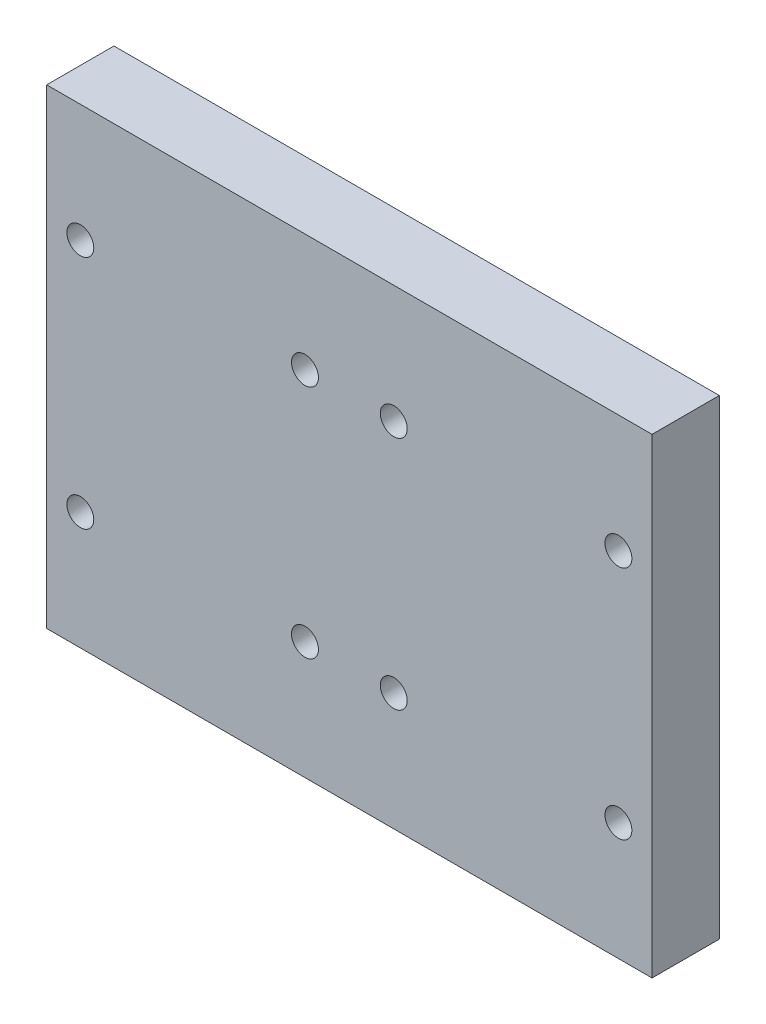
ISO-10303-21;
HEADER;
FILE_DESCRIPTION(('STEP AP214'),'2;1');
FILE_NAME('part.step','',(''),(''),'','','');
FILE_SCHEMA(('AUTOMOTIVE_DESIGN { 1 0 10303 214 1 1 1 1 }'));
ENDSEC;
DATA;
#1=APPLICATION_CONTEXT('core data for automotive mechanical design processes');
#2=APPLICATION_PROTOCOL_DEFINITION('international standard','automotive_design',2000,#1);
#3=PRODUCT_CONTEXT('',#1,'mechanical');
#4=PRODUCT('Part','Part','',(#3));
#5=PRODUCT_RELATED_PRODUCT_CATEGORY('part','',(#4));
#6=PRODUCT_DEFINITION_FORMATION('','',#4);
#7=PRODUCT_DEFINITION_CONTEXT('part definition',#1,'design');
#8=PRODUCT_DEFINITION('design','',#6,#7);
#9=PRODUCT_DEFINITION_SHAPE('','',#8);
#10=(LENGTH_UNIT() NAMED_UNIT(*) SI_UNIT(.MILLI.,.METRE.));
#11=(NAMED_UNIT(*) PLANE_ANGLE_UNIT() SI_UNIT($,.RADIAN.));
#12=(NAMED_UNIT(*) SI_UNIT($,.STERADIAN.) SOLID_ANGLE_UNIT());
#13=UNCERTAINTY_MEASURE_WITH_UNIT(LENGTH_MEASURE(1.E-05),#10,'distance_accuracy_value','');
#14=(GEOMETRIC_REPRESENTATION_CONTEXT(3) GLOBAL_UNCERTAINTY_ASSIGNED_CONTEXT((#13)) GLOBAL_UNIT_ASSIGNED_CONTEXT((#10,
#11,#12)) REPRESENTATION_CONTEXT('',''));
#15=CARTESIAN_POINT('',(0.,0.,0.));
#16=DIRECTION('',(0.,0.,1.));
#17=DIRECTION('',(1.,0.,0.));
#18=AXIS2_PLACEMENT_3D('',#15,#16,#17);
#19=CARTESIAN_POINT('',(0.,0.,10.));
#20=DIRECTION('',(0.,0.,1.));
#21=DIRECTION('',(1.,0.,0.));
#22=AXIS2_PLACEMENT_3D('',#19,#20,#21);
#23=PLANE('',#22);
#24=CARTESIAN_POINT('',(83.,-17.5,10.));
#25=DIRECTION('',(0.,0.,1.));
#26=DIRECTION('',(-1.,0.,0.));
#27=AXIS2_PLACEMENT_3D('',#24,#25,#26);
#28=CIRCLE('',#27,2.00000000000001);
#29=CARTESIAN_POINT('',(81.,-17.5,10.));
#30=VERTEX_POINT('',#29);
#31=EDGE_CURVE('E112',#30,#30,#28,.T.);
#32=ORIENTED_EDGE('',*,*,#31,.F.);
#33=EDGE_LOOP('',(#32));
#34=FACE_BOUND('',#33,.T.);
#35=CARTESIAN_POINT('',(49.6,-52.5,10.));
#36=DIRECTION('',(0.,0.,1.));
#37=DIRECTION('',(-1.,0.,0.));
#38=AXIS2_PLACEMENT_3D('',#35,#36,#37);
#39=CIRCLE('',#38,2.00000000000001);
#40=CARTESIAN_POINT('',(47.6,-52.5,10.));
#41=VERTEX_POINT('',#40);
#42=EDGE_CURVE('E124',#41,#41,#39,.T.);
#43=ORIENTED_EDGE('',*,*,#42,.F.);
#44=EDGE_LOOP('',(#43));
#45=FACE_BOUND('',#44,.T.);
#46=CARTESIAN_POINT('',(36.4,-52.5,10.));
#47=DIRECTION('',(0.,0.,1.));
#48=DIRECTION('',(1.,0.,0.));
#49=AXIS2_PLACEMENT_3D('',#46,#47,#48);
#50=CIRCLE('',#49,2.);
#51=CARTESIAN_POINT('',(38.4,-52.5,10.));
#52=VERTEX_POINT('',#51);
#53=EDGE_CURVE('E136',#52,#52,#50,.T.);
#54=ORIENTED_EDGE('',*,*,#53,.F.);
#55=EDGE_LOOP('',(#54));
#56=FACE_BOUND('',#55,.T.);
#57=CARTESIAN_POINT('',(3.,-17.5,10.));
#58=DIRECTION('',(0.,0.,1.));
#59=DIRECTION('',(1.,0.,0.));
#60=AXIS2_PLACEMENT_3D('',#57,#58,#59);
#61=CIRCLE('',#60,2.);
#62=CARTESIAN_POINT('',(5.,-17.5,10.));
#63=VERTEX_POINT('',#62);
#64=EDGE_CURVE('E83',#63,#63,#61,.T.);
#65=ORIENTED_EDGE('',*,*,#64,.F.);
#66=EDGE_LOOP('',(#65));
#67=FACE_BOUND('',#66,.T.);
#68=DIRECTION('',(-1.,0.,0.));
#69=VECTOR('',#68,1.);
#70=CARTESIAN_POINT('',(0.,0.,10.));
#71=LINE('',#70,#69);
#72=CARTESIAN_POINT('',(88.,0.,10.));
#73=VERTEX_POINT('',#72);
#74=CARTESIAN_POINT('',(-2.,0.,10.));
#75=VERTEX_POINT('',#74);
#76=EDGE_CURVE('E11',#73,#75,#71,.T.);
#77=ORIENTED_EDGE('',*,*,#76,.T.);
#78=DIRECTION('',(0.,1.,0.));
#79=VECTOR('',#78,1.);
#80=CARTESIAN_POINT('',(-2.,0.,10.));
#81=LINE('',#80,#79);
#82=CARTESIAN_POINT('',(-1.99999999999998,-70.,10.));
#83=VERTEX_POINT('',#82);
#84=EDGE_CURVE('E92',#83,#75,#81,.T.);
#85=ORIENTED_EDGE('',*,*,#84,.F.);
#86=DIRECTION('',(1.,0.,0.));
#87=VECTOR('',#86,1.);
#88=CARTESIAN_POINT('',(0.,-70.,10.));
#89=LINE('',#88,#87);
#90=CARTESIAN_POINT('',(88.0000000000001,-70.,10.));
#91=VERTEX_POINT('',#90);
#92=EDGE_CURVE('E43',#83,#91,#89,.T.);
#93=ORIENTED_EDGE('',*,*,#92,.T.);
#94=DIRECTION('',(0.,-1.,0.));
#95=VECTOR('',#94,1.);
#96=CARTESIAN_POINT('',(88.,0.,10.));
#97=LINE('',#96,#95);
#98=EDGE_CURVE('E97',#73,#91,#97,.T.);
#99=ORIENTED_EDGE('',*,*,#98,.F.);
#100=EDGE_LOOP('',(#77,#85,#93,#99));
#101=FACE_BOUND('',#100,.T.);
#102=CARTESIAN_POINT('',(3.00000000000001,-52.5,10.));
#103=DIRECTION('',(0.,0.,1.));
#104=DIRECTION('',(1.,0.,0.));
#105=AXIS2_PLACEMENT_3D('',#102,#103,#104);
#106=CIRCLE('',#105,2.);
#107=CARTESIAN_POINT('',(5.00000000000001,-52.5,10.));
#108=VERTEX_POINT('',#107);
#109=EDGE_CURVE('E142',#108,#108,#106,.T.);
#110=ORIENTED_EDGE('',*,*,#109,.F.);
#111=EDGE_LOOP('',(#110));
#112=FACE_BOUND('',#111,.T.);
#113=CARTESIAN_POINT('',(36.4,-17.5,10.));
#114=DIRECTION('',(0.,0.,1.));
#115=DIRECTION('',(1.,0.,0.));
#116=AXIS2_PLACEMENT_3D('',#113,#114,#115);
#117=CIRCLE('',#116,2.);
#118=CARTESIAN_POINT('',(38.4,-17.5,10.));
#119=VERTEX_POINT('',#118);
#120=EDGE_CURVE('E130',#119,#119,#117,.T.);
#121=ORIENTED_EDGE('',*,*,#120,.F.);
#122=EDGE_LOOP('',(#121));
#123=FACE_BOUND('',#122,.T.);
#124=CARTESIAN_POINT('',(83.,-52.5,10.));
#125=DIRECTION('',(0.,0.,1.));
#126=DIRECTION('',(-1.,0.,0.));
#127=AXIS2_PLACEMENT_3D('',#124,#125,#126);
#128=CIRCLE('',#127,2.00000000000001);
#129=CARTESIAN_POINT('',(81.,-52.5,10.));
#130=VERTEX_POINT('',#129);
#131=EDGE_CURVE('E118',#130,#130,#128,.T.);
#132=ORIENTED_EDGE('',*,*,#131,.F.);
#133=EDGE_LOOP('',(#132));
#134=FACE_BOUND('',#133,.T.);
#135=CARTESIAN_POINT('',(49.6,-17.5,10.));
#136=DIRECTION('',(0.,0.,1.));
#137=DIRECTION('',(-1.,0.,0.));
#138=AXIS2_PLACEMENT_3D('',#135,#136,#137);
#139=CIRCLE('',#138,2.);
#140=CARTESIAN_POINT('',(47.6,-17.5,10.));
#141=VERTEX_POINT('',#140);
#142=EDGE_CURVE('E106',#141,#141,#139,.T.);
#143=ORIENTED_EDGE('',*,*,#142,.F.);
#144=EDGE_LOOP('',(#143));
#145=FACE_BOUND('',#144,.T.);
#146=ADVANCED_FACE('F33',(#34,#45,#56,#67,#101,#112,#123,#134,#145),#23,.T.);
#147=CARTESIAN_POINT('',(0.,0.,0.));
#148=DIRECTION('',(0.,0.,1.));
#149=DIRECTION('',(1.,0.,0.));
#150=AXIS2_PLACEMENT_3D('',#147,#148,#149);
#151=PLANE('',#150);
#152=DIRECTION('',(1.,0.,0.));
#153=VECTOR('',#152,1.);
#154=CARTESIAN_POINT('',(0.,-70.,0.));
#155=LINE('',#154,#153);
#156=CARTESIAN_POINT('',(-1.99999999999998,-70.,0.));
#157=VERTEX_POINT('',#156);
#158=CARTESIAN_POINT('',(88.0000000000001,-70.,0.));
#159=VERTEX_POINT('',#158);
#160=EDGE_CURVE('E75',#157,#159,#155,.T.);
#161=ORIENTED_EDGE('',*,*,#160,.F.);
#162=DIRECTION('',(0.,1.,0.));
#163=VECTOR('',#162,1.);
#164=CARTESIAN_POINT('',(-2.,0.,0.));
#165=LINE('',#164,#163);
#166=CARTESIAN_POINT('',(-2.,0.,0.));
#167=VERTEX_POINT('',#166);
#168=EDGE_CURVE('E79',#157,#167,#165,.T.);
#169=ORIENTED_EDGE('',*,*,#168,.T.);
#170=DIRECTION('',(-1.,0.,0.));
#171=VECTOR('',#170,1.);
#172=CARTESIAN_POINT('',(0.,0.,0.));
#173=LINE('',#172,#171);
#174=CARTESIAN_POINT('',(88.,0.,0.));
#175=VERTEX_POINT('',#174);
#176=EDGE_CURVE('E37',#175,#167,#173,.T.);
#177=ORIENTED_EDGE('',*,*,#176,.F.);
#178=DIRECTION('',(0.,-1.,0.));
#179=VECTOR('',#178,1.);
#180=CARTESIAN_POINT('',(88.,0.,0.));
#181=LINE('',#180,#179);
#182=EDGE_CURVE('E81',#175,#159,#181,.T.);
#183=ORIENTED_EDGE('',*,*,#182,.T.);
#184=EDGE_LOOP('',(#161,#169,#177,#183));
#185=FACE_BOUND('',#184,.T.);
#186=CARTESIAN_POINT('',(3.,-17.5,0.));
#187=DIRECTION('',(0.,0.,1.));
#188=DIRECTION('',(1.,0.,0.));
#189=AXIS2_PLACEMENT_3D('',#186,#187,#188);
#190=CIRCLE('',#189,2.);
#191=CARTESIAN_POINT('',(5.,-17.5,0.));
#192=VERTEX_POINT('',#191);
#193=EDGE_CURVE('E145',#192,#192,#190,.T.);
#194=ORIENTED_EDGE('',*,*,#193,.T.);
#195=EDGE_LOOP('',(#194));
#196=FACE_BOUND('',#195,.T.);
#197=CARTESIAN_POINT('',(3.00000000000001,-52.5,0.));
#198=DIRECTION('',(0.,0.,1.));
#199=DIRECTION('',(1.,0.,0.));
#200=AXIS2_PLACEMENT_3D('',#197,#198,#199);
#201=CIRCLE('',#200,2.);
#202=CARTESIAN_POINT('',(5.00000000000001,-52.5,0.));
#203=VERTEX_POINT('',#202);
#204=EDGE_CURVE('E139',#203,#203,#201,.T.);
#205=ORIENTED_EDGE('',*,*,#204,.T.);
#206=EDGE_LOOP('',(#205));
#207=FACE_BOUND('',#206,.T.);
#208=CARTESIAN_POINT('',(36.4,-52.5,0.));
#209=DIRECTION('',(0.,0.,1.));
#210=DIRECTION('',(1.,0.,0.));
#211=AXIS2_PLACEMENT_3D('',#208,#209,#210);
#212=CIRCLE('',#211,2.);
#213=CARTESIAN_POINT('',(38.4,-52.5,0.));
#214=VERTEX_POINT('',#213);
#215=EDGE_CURVE('E133',#214,#214,#212,.T.);
#216=ORIENTED_EDGE('',*,*,#215,.T.);
#217=EDGE_LOOP('',(#216));
#218=FACE_BOUND('',#217,.T.);
#219=CARTESIAN_POINT('',(36.4,-17.5,0.));
#220=DIRECTION('',(0.,0.,1.));
#221=DIRECTION('',(1.,0.,0.));
#222=AXIS2_PLACEMENT_3D('',#219,#220,#221);
#223=CIRCLE('',#222,2.);
#224=CARTESIAN_POINT('',(38.4,-17.5,0.));
#225=VERTEX_POINT('',#224);
#226=EDGE_CURVE('E127',#225,#225,#223,.T.);
#227=ORIENTED_EDGE('',*,*,#226,.T.);
#228=EDGE_LOOP('',(#227));
#229=FACE_BOUND('',#228,.T.);
#230=CARTESIAN_POINT('',(49.6,-52.5,0.));
#231=DIRECTION('',(0.,0.,1.));
#232=DIRECTION('',(-1.,0.,0.));
#233=AXIS2_PLACEMENT_3D('',#230,#231,#232);
#234=CIRCLE('',#233,2.00000000000001);
#235=CARTESIAN_POINT('',(47.6,-52.5,0.));
#236=VERTEX_POINT('',#235);
#237=EDGE_CURVE('E121',#236,#236,#234,.T.);
#238=ORIENTED_EDGE('',*,*,#237,.T.);
#239=EDGE_LOOP('',(#238));
#240=FACE_BOUND('',#239,.T.);
#241=CARTESIAN_POINT('',(83.,-52.5,0.));
#242=DIRECTION('',(0.,0.,1.));
#243=DIRECTION('',(-1.,0.,0.));
#244=AXIS2_PLACEMENT_3D('',#241,#242,#243);
#245=CIRCLE('',#244,2.00000000000001);
#246=CARTESIAN_POINT('',(81.,-52.5,0.));
#247=VERTEX_POINT('',#246);
#248=EDGE_CURVE('E115',#247,#247,#245,.T.);
#249=ORIENTED_EDGE('',*,*,#248,.T.);
#250=EDGE_LOOP('',(#249));
#251=FACE_BOUND('',#250,.T.);
#252=CARTESIAN_POINT('',(83.,-17.5,0.));
#253=DIRECTION('',(0.,0.,1.));
#254=DIRECTION('',(-1.,0.,0.));
#255=AXIS2_PLACEMENT_3D('',#252,#253,#254);
#256=CIRCLE('',#255,2.00000000000001);
#257=CARTESIAN_POINT('',(81.,-17.5,0.));
#258=VERTEX_POINT('',#257);
#259=EDGE_CURVE('E109',#258,#258,#256,.T.);
#260=ORIENTED_EDGE('',*,*,#259,.T.);
#261=EDGE_LOOP('',(#260));
#262=FACE_BOUND('',#261,.T.);
#263=CARTESIAN_POINT('',(49.6,-17.5,0.));
#264=DIRECTION('',(0.,0.,1.));
#265=DIRECTION('',(-1.,0.,0.));
#266=AXIS2_PLACEMENT_3D('',#263,#264,#265);
#267=CIRCLE('',#266,2.);
#268=CARTESIAN_POINT('',(47.6,-17.5,0.));
#269=VERTEX_POINT('',#268);
#270=EDGE_CURVE('E104',#269,#269,#267,.T.);
#271=ORIENTED_EDGE('',*,*,#270,.T.);
#272=EDGE_LOOP('',(#271));
#273=FACE_BOUND('',#272,.T.);
#274=ADVANCED_FACE('F76',(#185,#196,#207,#218,#229,#240,#251,#262,#273),#151,.F.);
#275=CARTESIAN_POINT('',(0.,-70.,10.));
#276=DIRECTION('',(0.,1.,0.));
#277=DIRECTION('',(-1.,0.,0.));
#278=AXIS2_PLACEMENT_3D('',#275,#276,#277);
#279=PLANE('',#278);
#280=ORIENTED_EDGE('',*,*,#160,.T.);
#281=DIRECTION('',(0.,0.,-1.));
#282=VECTOR('',#281,1.);
#283=CARTESIAN_POINT('',(88.0000000000001,-70.,10.));
#284=LINE('',#283,#282);
#285=EDGE_CURVE('E102',#91,#159,#284,.T.);
#286=ORIENTED_EDGE('',*,*,#285,.F.);
#287=ORIENTED_EDGE('',*,*,#92,.F.);
#288=DIRECTION('',(0.,0.,-1.));
#289=VECTOR('',#288,1.);
#290=CARTESIAN_POINT('',(-1.99999999999998,-70.,10.));
#291=LINE('',#290,#289);
#292=EDGE_CURVE('E84',#83,#157,#291,.T.);
#293=ORIENTED_EDGE('',*,*,#292,.T.);
#294=EDGE_LOOP('',(#280,#286,#287,#293));
#295=FACE_BOUND('',#294,.T.);
#296=ADVANCED_FACE('F35',(#295),#279,.F.);
#297=CARTESIAN_POINT('',(0.,0.,10.));
#298=DIRECTION('',(0.,-1.,0.));
#299=DIRECTION('',(1.,0.,0.));
#300=AXIS2_PLACEMENT_3D('',#297,#298,#299);
#301=PLANE('',#300);
#302=ORIENTED_EDGE('',*,*,#176,.T.);
#303=DIRECTION('',(0.,0.,-1.));
#304=VECTOR('',#303,1.);
#305=CARTESIAN_POINT('',(-2.,0.,10.));
#306=LINE('',#305,#304);
#307=EDGE_CURVE('E87',#75,#167,#306,.T.);
#308=ORIENTED_EDGE('',*,*,#307,.F.);
#309=ORIENTED_EDGE('',*,*,#76,.F.);
#310=DIRECTION('',(0.,0.,-1.));
#311=VECTOR('',#310,1.);
#312=CARTESIAN_POINT('',(88.,0.,10.));
#313=LINE('',#312,#311);
#314=EDGE_CURVE('E100',#73,#175,#313,.T.);
#315=ORIENTED_EDGE('',*,*,#314,.T.);
#316=EDGE_LOOP('',(#302,#308,#309,#315));
#317=FACE_BOUND('',#316,.T.);
#318=ADVANCED_FACE('F153',(#317),#301,.F.);
#319=CARTESIAN_POINT('',(3.,-17.5,10.));
#320=DIRECTION('',(0.,0.,-1.));
#321=DIRECTION('',(-1.,0.,0.));
#322=AXIS2_PLACEMENT_3D('',#319,#320,#321);
#323=CYLINDRICAL_SURFACE('',#322,2.);
#324=ORIENTED_EDGE('',*,*,#64,.T.);
#325=EDGE_LOOP('',(#324));
#326=FACE_BOUND('',#325,.T.);
#327=ORIENTED_EDGE('',*,*,#193,.F.);
#328=EDGE_LOOP('',(#327));
#329=FACE_BOUND('',#328,.T.);
#330=ADVANCED_FACE('F183',(#326,#329),#323,.F.);
#331=CARTESIAN_POINT('',(3.00000000000001,-52.5,10.));
#332=DIRECTION('',(0.,0.,-1.));
#333=DIRECTION('',(-1.,0.,0.));
#334=AXIS2_PLACEMENT_3D('',#331,#332,#333);
#335=CYLINDRICAL_SURFACE('',#334,2.);
#336=ORIENTED_EDGE('',*,*,#109,.T.);
#337=EDGE_LOOP('',(#336));
#338=FACE_BOUND('',#337,.T.);
#339=ORIENTED_EDGE('',*,*,#204,.F.);
#340=EDGE_LOOP('',(#339));
#341=FACE_BOUND('',#340,.T.);
#342=ADVANCED_FACE('F187',(#338,#341),#335,.F.);
#343=CARTESIAN_POINT('',(36.4,-52.5,10.));
#344=DIRECTION('',(0.,0.,-1.));
#345=DIRECTION('',(-1.,0.,0.));
#346=AXIS2_PLACEMENT_3D('',#343,#344,#345);
#347=CYLINDRICAL_SURFACE('',#346,2.);
#348=ORIENTED_EDGE('',*,*,#53,.T.);
#349=EDGE_LOOP('',(#348));
#350=FACE_BOUND('',#349,.T.);
#351=ORIENTED_EDGE('',*,*,#215,.F.);
#352=EDGE_LOOP('',(#351));
#353=FACE_BOUND('',#352,.T.);
#354=ADVANCED_FACE('F192',(#350,#353),#347,.F.);
#355=CARTESIAN_POINT('',(36.4,-17.5,10.));
#356=DIRECTION('',(0.,0.,-1.));
#357=DIRECTION('',(-1.,0.,0.));
#358=AXIS2_PLACEMENT_3D('',#355,#356,#357);
#359=CYLINDRICAL_SURFACE('',#358,2.);
#360=ORIENTED_EDGE('',*,*,#120,.T.);
#361=EDGE_LOOP('',(#360));
#362=FACE_BOUND('',#361,.T.);
#363=ORIENTED_EDGE('',*,*,#226,.F.);
#364=EDGE_LOOP('',(#363));
#365=FACE_BOUND('',#364,.T.);
#366=ADVANCED_FACE('F199',(#362,#365),#359,.F.);
#367=CARTESIAN_POINT('',(49.6,-52.5,10.));
#368=DIRECTION('',(0.,0.,-1.));
#369=DIRECTION('',(-1.,0.,0.));
#370=AXIS2_PLACEMENT_3D('',#367,#368,#369);
#371=CYLINDRICAL_SURFACE('',#370,2.00000000000001);
#372=ORIENTED_EDGE('',*,*,#42,.T.);
#373=EDGE_LOOP('',(#372));
#374=FACE_BOUND('',#373,.T.);
#375=ORIENTED_EDGE('',*,*,#237,.F.);
#376=EDGE_LOOP('',(#375));
#377=FACE_BOUND('',#376,.T.);
#378=ADVANCED_FACE('F203',(#374,#377),#371,.F.);
#379=CARTESIAN_POINT('',(83.,-52.5,10.));
#380=DIRECTION('',(0.,0.,-1.));
#381=DIRECTION('',(-1.,0.,0.));
#382=AXIS2_PLACEMENT_3D('',#379,#380,#381);
#383=CYLINDRICAL_SURFACE('',#382,2.00000000000001);
#384=ORIENTED_EDGE('',*,*,#131,.T.);
#385=EDGE_LOOP('',(#384));
#386=FACE_BOUND('',#385,.T.);
#387=ORIENTED_EDGE('',*,*,#248,.F.);
#388=EDGE_LOOP('',(#387));
#389=FACE_BOUND('',#388,.T.);
#390=ADVANCED_FACE('F207',(#386,#389),#383,.F.);
#391=CARTESIAN_POINT('',(83.,-17.5,10.));
#392=DIRECTION('',(0.,0.,-1.));
#393=DIRECTION('',(-1.,0.,0.));
#394=AXIS2_PLACEMENT_3D('',#391,#392,#393);
#395=CYLINDRICAL_SURFACE('',#394,2.00000000000001);
#396=ORIENTED_EDGE('',*,*,#31,.T.);
#397=EDGE_LOOP('',(#396));
#398=FACE_BOUND('',#397,.T.);
#399=ORIENTED_EDGE('',*,*,#259,.F.);
#400=EDGE_LOOP('',(#399));
#401=FACE_BOUND('',#400,.T.);
#402=ADVANCED_FACE('F172',(#398,#401),#395,.F.);
#403=CARTESIAN_POINT('',(49.6,-17.5,10.));
#404=DIRECTION('',(0.,0.,-1.));
#405=DIRECTION('',(-1.,0.,0.));
#406=AXIS2_PLACEMENT_3D('',#403,#404,#405);
#407=CYLINDRICAL_SURFACE('',#406,2.);
#408=ORIENTED_EDGE('',*,*,#142,.T.);
#409=EDGE_LOOP('',(#408));
#410=FACE_BOUND('',#409,.T.);
#411=ORIENTED_EDGE('',*,*,#270,.F.);
#412=EDGE_LOOP('',(#411));
#413=FACE_BOUND('',#412,.T.);
#414=ADVANCED_FACE('F169',(#410,#413),#407,.F.);
#415=CARTESIAN_POINT('',(88.,0.,10.));
#416=DIRECTION('',(1.,0.,0.));
#417=DIRECTION('',(0.,1.,0.));
#418=AXIS2_PLACEMENT_3D('',#415,#416,#417);
#419=PLANE('',#418);
#420=ORIENTED_EDGE('',*,*,#182,.F.);
#421=ORIENTED_EDGE('',*,*,#314,.F.);
#422=ORIENTED_EDGE('',*,*,#98,.T.);
#423=ORIENTED_EDGE('',*,*,#285,.T.);
#424=EDGE_LOOP('',(#420,#421,#422,#423));
#425=FACE_BOUND('',#424,.T.);
#426=ADVANCED_FACE('F156',(#425),#419,.T.);
#427=CARTESIAN_POINT('',(-2.,0.,10.));
#428=DIRECTION('',(-1.,0.,0.));
#429=DIRECTION('',(0.,-1.,0.));
#430=AXIS2_PLACEMENT_3D('',#427,#428,#429);
#431=PLANE('',#430);
#432=ORIENTED_EDGE('',*,*,#168,.F.);
#433=ORIENTED_EDGE('',*,*,#292,.F.);
#434=ORIENTED_EDGE('',*,*,#84,.T.);
#435=ORIENTED_EDGE('',*,*,#307,.T.);
#436=EDGE_LOOP('',(#432,#433,#434,#435));
#437=FACE_BOUND('',#436,.T.);
#438=ADVANCED_FACE('F90',(#437),#431,.T.);
#439=CLOSED_SHELL('',(#146,#274,#296,#318,#330,#342,#354,#366,#378,#390,#402,#414,#426,#438));
#440=MANIFOLD_SOLID_BREP('B2',#439);
#441=ADVANCED_BREP_SHAPE_REPRESENTATION('',(#18,#440),#14);
#442=SHAPE_DEFINITION_REPRESENTATION(#9,#441);
ENDSEC;
END-ISO-10303-21;
